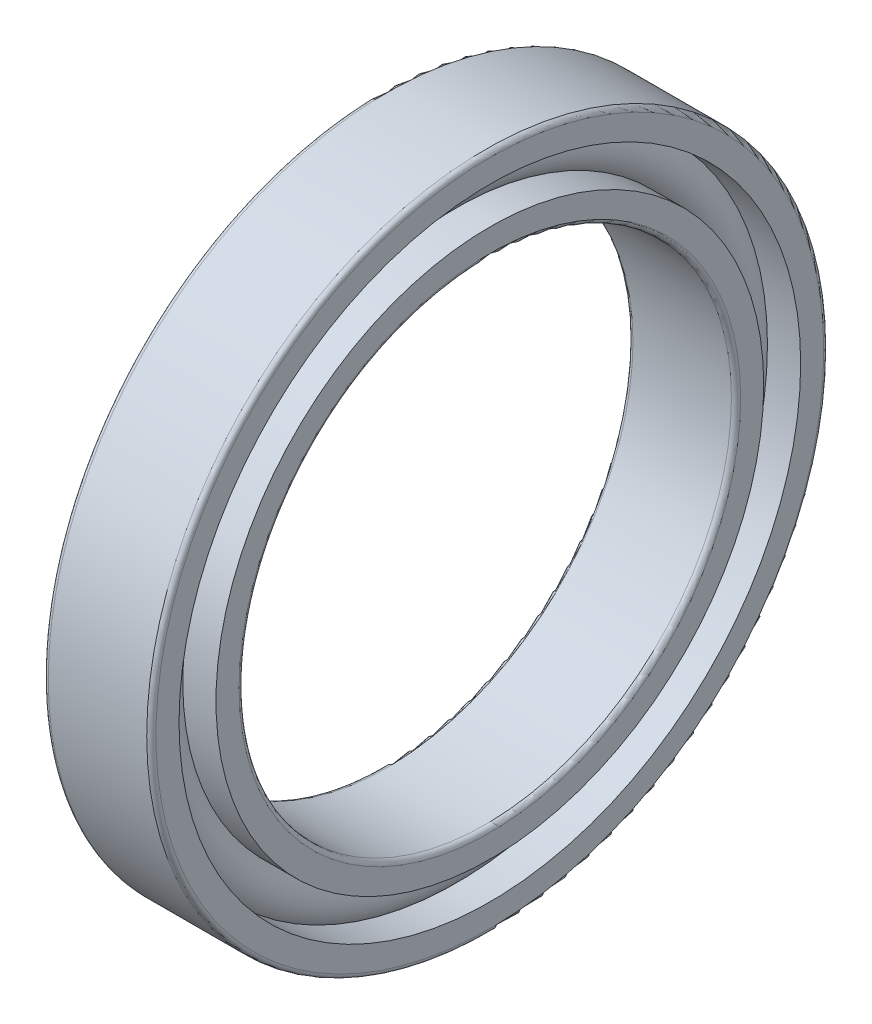
ISO-10303-21;
HEADER;
FILE_DESCRIPTION(('STEP AP214'),'2;1');
FILE_NAME('part.step','',(''),(''),'','','');
FILE_SCHEMA(('AUTOMOTIVE_DESIGN { 1 0 10303 214 1 1 1 1 }'));
ENDSEC;
DATA;
#1=APPLICATION_CONTEXT('core data for automotive mechanical design processes');
#2=APPLICATION_PROTOCOL_DEFINITION('international standard','automotive_design',2000,#1);
#3=PRODUCT_CONTEXT('',#1,'mechanical');
#4=PRODUCT('Part','Part','',(#3));
#5=PRODUCT_RELATED_PRODUCT_CATEGORY('part','',(#4));
#6=PRODUCT_DEFINITION_FORMATION('','',#4);
#7=PRODUCT_DEFINITION_CONTEXT('part definition',#1,'design');
#8=PRODUCT_DEFINITION('design','',#6,#7);
#9=PRODUCT_DEFINITION_SHAPE('','',#8);
#10=(LENGTH_UNIT() NAMED_UNIT(*) SI_UNIT(.MILLI.,.METRE.));
#11=(NAMED_UNIT(*) PLANE_ANGLE_UNIT() SI_UNIT($,.RADIAN.));
#12=(NAMED_UNIT(*) SI_UNIT($,.STERADIAN.) SOLID_ANGLE_UNIT());
#13=UNCERTAINTY_MEASURE_WITH_UNIT(LENGTH_MEASURE(1.E-05),#10,'distance_accuracy_value','');
#14=(GEOMETRIC_REPRESENTATION_CONTEXT(3) GLOBAL_UNCERTAINTY_ASSIGNED_CONTEXT((#13)) GLOBAL_UNIT_ASSIGNED_CONTEXT((#10,
#11,#12)) REPRESENTATION_CONTEXT('',''));
#15=CARTESIAN_POINT('',(0.,0.,0.));
#16=DIRECTION('',(0.,0.,1.));
#17=DIRECTION('',(1.,0.,0.));
#18=AXIS2_PLACEMENT_3D('',#15,#16,#17);
#19=CARTESIAN_POINT('',(0.,0.,0.));
#20=DIRECTION('',(-1.,0.,0.));
#21=DIRECTION('',(0.,0.,1.));
#22=AXIS2_PLACEMENT_3D('',#19,#20,#21);
#23=TOROIDAL_SURFACE('',#22,19.,1.8);
#24=CARTESIAN_POINT('',(1.34164078649987,0.,0.));
#25=DIRECTION('',(-1.,0.,0.));
#26=DIRECTION('',(0.,0.,1.));
#27=AXIS2_PLACEMENT_3D('',#24,#25,#26);
#28=CIRCLE('',#27,20.2);
#29=CARTESIAN_POINT('',(1.34164078649987,0.,20.2));
#30=VERTEX_POINT('',#29);
#31=EDGE_CURVE('E38',#30,#30,#28,.F.);
#32=ORIENTED_EDGE('',*,*,#31,.T.);
#33=EDGE_LOOP('',(#32));
#34=FACE_BOUND('',#33,.T.);
#35=CARTESIAN_POINT('',(1.34164078649988,0.,0.));
#36=DIRECTION('',(-1.,0.,0.));
#37=DIRECTION('',(0.,0.,1.));
#38=AXIS2_PLACEMENT_3D('',#35,#36,#37);
#39=CIRCLE('',#38,17.8);
#40=CARTESIAN_POINT('',(1.34164078649988,0.,17.8));
#41=VERTEX_POINT('',#40);
#42=EDGE_CURVE('E10',#41,#41,#39,.T.);
#43=ORIENTED_EDGE('',*,*,#42,.T.);
#44=EDGE_LOOP('',(#43));
#45=FACE_BOUND('',#44,.T.);
#46=ADVANCED_FACE('F34',(#34,#45),#23,.T.);
#47=CARTESIAN_POINT('',(-20.6375,0.,0.));
#48=DIRECTION('',(1.,0.,0.));
#49=DIRECTION('',(0.,0.,-1.));
#50=AXIS2_PLACEMENT_3D('',#47,#48,#49);
#51=CYLINDRICAL_SURFACE('',#50,17.8);
#52=CARTESIAN_POINT('',(3.5,0.,0.));
#53=DIRECTION('',(1.,0.,0.));
#54=DIRECTION('',(0.,0.,-1.));
#55=AXIS2_PLACEMENT_3D('',#52,#53,#54);
#56=CIRCLE('',#55,17.8);
#57=CARTESIAN_POINT('',(3.5,0.,-17.8));
#58=VERTEX_POINT('',#57);
#59=EDGE_CURVE('E47',#58,#58,#56,.T.);
#60=ORIENTED_EDGE('',*,*,#59,.F.);
#61=EDGE_LOOP('',(#60));
#62=FACE_BOUND('',#61,.T.);
#63=ORIENTED_EDGE('',*,*,#42,.F.);
#64=EDGE_LOOP('',(#63));
#65=FACE_BOUND('',#64,.T.);
#66=ADVANCED_FACE('F86',(#62,#65),#51,.T.);
#67=CARTESIAN_POINT('',(-20.6375,0.,0.));
#68=DIRECTION('',(1.,0.,0.));
#69=DIRECTION('',(0.,0.,-1.));
#70=AXIS2_PLACEMENT_3D('',#67,#68,#69);
#71=CYLINDRICAL_SURFACE('',#70,17.8);
#72=CARTESIAN_POINT('',(-3.5,0.,0.));
#73=DIRECTION('',(1.,0.,0.));
#74=DIRECTION('',(0.,0.,-1.));
#75=AXIS2_PLACEMENT_3D('',#72,#73,#74);
#76=CIRCLE('',#75,17.8);
#77=CARTESIAN_POINT('',(-3.5,0.,-17.8));
#78=VERTEX_POINT('',#77);
#79=EDGE_CURVE('E56',#78,#78,#76,.T.);
#80=ORIENTED_EDGE('',*,*,#79,.T.);
#81=EDGE_LOOP('',(#80));
#82=FACE_BOUND('',#81,.T.);
#83=CARTESIAN_POINT('',(-1.34164078649988,0.,0.));
#84=DIRECTION('',(1.,0.,0.));
#85=DIRECTION('',(0.,0.,-1.));
#86=AXIS2_PLACEMENT_3D('',#83,#84,#85);
#87=CIRCLE('',#86,17.8);
#88=CARTESIAN_POINT('',(-1.34164078649988,0.,-17.8));
#89=VERTEX_POINT('',#88);
#90=EDGE_CURVE('E42',#89,#89,#87,.T.);
#91=ORIENTED_EDGE('',*,*,#90,.F.);
#92=EDGE_LOOP('',(#91));
#93=FACE_BOUND('',#92,.T.);
#94=ADVANCED_FACE('F89',(#82,#93),#71,.T.);
#95=CARTESIAN_POINT('',(3.5,16.3,0.));
#96=DIRECTION('',(1.,0.,0.));
#97=DIRECTION('',(0.,0.,-1.));
#98=AXIS2_PLACEMENT_3D('',#95,#96,#97);
#99=PLANE('',#98);
#100=ORIENTED_EDGE('',*,*,#59,.T.);
#101=EDGE_LOOP('',(#100));
#102=FACE_BOUND('',#101,.T.);
#103=CARTESIAN_POINT('',(3.5,0.,0.));
#104=DIRECTION('',(1.,0.,0.));
#105=DIRECTION('',(0.,0.,-1.));
#106=AXIS2_PLACEMENT_3D('',#103,#104,#105);
#107=CIRCLE('',#106,16.3);
#108=CARTESIAN_POINT('',(3.5,0.,-16.3));
#109=VERTEX_POINT('',#108);
#110=EDGE_CURVE('E78',#109,#109,#107,.T.);
#111=ORIENTED_EDGE('',*,*,#110,.F.);
#112=EDGE_LOOP('',(#111));
#113=FACE_BOUND('',#112,.T.);
#114=ADVANCED_FACE('F83',(#102,#113),#99,.T.);
#115=CARTESIAN_POINT('',(3.2,0.,0.));
#116=DIRECTION('',(1.,0.,0.));
#117=DIRECTION('',(0.,0.,-1.));
#118=AXIS2_PLACEMENT_3D('',#115,#116,#117);
#119=TOROIDAL_SURFACE('',#118,16.3,0.300000000000001);
#120=ORIENTED_EDGE('',*,*,#110,.T.);
#121=EDGE_LOOP('',(#120));
#122=FACE_BOUND('',#121,.T.);
#123=CARTESIAN_POINT('',(3.2,0.,0.));
#124=DIRECTION('',(1.,0.,0.));
#125=DIRECTION('',(0.,0.,-1.));
#126=AXIS2_PLACEMENT_3D('',#123,#124,#125);
#127=CIRCLE('',#126,16.);
#128=CARTESIAN_POINT('',(3.2,0.,-16.));
#129=VERTEX_POINT('',#128);
#130=EDGE_CURVE('E75',#129,#129,#127,.T.);
#131=ORIENTED_EDGE('',*,*,#130,.F.);
#132=EDGE_LOOP('',(#131));
#133=FACE_BOUND('',#132,.T.);
#134=ADVANCED_FACE('F100',(#122,#133),#119,.T.);
#135=CARTESIAN_POINT('',(-20.6375,0.,0.));
#136=DIRECTION('',(1.,0.,0.));
#137=DIRECTION('',(0.,0.,-1.));
#138=AXIS2_PLACEMENT_3D('',#135,#136,#137);
#139=CYLINDRICAL_SURFACE('',#138,16.);
#140=ORIENTED_EDGE('',*,*,#130,.T.);
#141=EDGE_LOOP('',(#140));
#142=FACE_BOUND('',#141,.T.);
#143=CARTESIAN_POINT('',(-3.2,0.,0.));
#144=DIRECTION('',(1.,0.,0.));
#145=DIRECTION('',(0.,0.,-1.));
#146=AXIS2_PLACEMENT_3D('',#143,#144,#145);
#147=CIRCLE('',#146,16.);
#148=CARTESIAN_POINT('',(-3.2,0.,-16.));
#149=VERTEX_POINT('',#148);
#150=EDGE_CURVE('E72',#149,#149,#147,.T.);
#151=ORIENTED_EDGE('',*,*,#150,.F.);
#152=EDGE_LOOP('',(#151));
#153=FACE_BOUND('',#152,.T.);
#154=ADVANCED_FACE('F103',(#142,#153),#139,.F.);
#155=CARTESIAN_POINT('',(-3.2,0.,0.));
#156=DIRECTION('',(1.,0.,0.));
#157=DIRECTION('',(0.,0.,-1.));
#158=AXIS2_PLACEMENT_3D('',#155,#156,#157);
#159=TOROIDAL_SURFACE('',#158,16.3,0.300000000000001);
#160=ORIENTED_EDGE('',*,*,#150,.T.);
#161=EDGE_LOOP('',(#160));
#162=FACE_BOUND('',#161,.T.);
#163=CARTESIAN_POINT('',(-3.5,0.,0.));
#164=DIRECTION('',(1.,0.,0.));
#165=DIRECTION('',(0.,0.,-1.));
#166=AXIS2_PLACEMENT_3D('',#163,#164,#165);
#167=CIRCLE('',#166,16.3);
#168=CARTESIAN_POINT('',(-3.5,0.,-16.3));
#169=VERTEX_POINT('',#168);
#170=EDGE_CURVE('E69',#169,#169,#167,.T.);
#171=ORIENTED_EDGE('',*,*,#170,.F.);
#172=EDGE_LOOP('',(#171));
#173=FACE_BOUND('',#172,.T.);
#174=ADVANCED_FACE('F107',(#162,#173),#159,.T.);
#175=CARTESIAN_POINT('',(-3.5,17.8,0.));
#176=DIRECTION('',(-1.,0.,0.));
#177=DIRECTION('',(0.,0.,1.));
#178=AXIS2_PLACEMENT_3D('',#175,#176,#177);
#179=PLANE('',#178);
#180=ORIENTED_EDGE('',*,*,#170,.T.);
#181=EDGE_LOOP('',(#180));
#182=FACE_BOUND('',#181,.T.);
#183=ORIENTED_EDGE('',*,*,#79,.F.);
#184=EDGE_LOOP('',(#183));
#185=FACE_BOUND('',#184,.T.);
#186=ADVANCED_FACE('F111',(#182,#185),#179,.T.);
#187=CARTESIAN_POINT('',(-1.34164078649987,0.,0.));
#188=DIRECTION('',(1.,0.,0.));
#189=DIRECTION('',(0.,0.,-1.));
#190=AXIS2_PLACEMENT_3D('',#187,#188,#189);
#191=CIRCLE('',#190,20.2);
#192=CARTESIAN_POINT('',(-1.34164078649987,0.,-20.2));
#193=VERTEX_POINT('',#192);
#194=EDGE_CURVE('E50',#193,#193,#191,.F.);
#195=ORIENTED_EDGE('',*,*,#194,.T.);
#196=EDGE_LOOP('',(#195));
#197=FACE_BOUND('',#196,.T.);
#198=ORIENTED_EDGE('',*,*,#90,.T.);
#199=EDGE_LOOP('',(#198));
#200=FACE_BOUND('',#199,.T.);
#201=ADVANCED_FACE('F36',(#197,#200),#23,.T.);
#202=CARTESIAN_POINT('',(-20.6375,0.,0.));
#203=DIRECTION('',(1.,0.,0.));
#204=DIRECTION('',(0.,0.,-1.));
#205=AXIS2_PLACEMENT_3D('',#202,#203,#204);
#206=CYLINDRICAL_SURFACE('',#205,20.2);
#207=CARTESIAN_POINT('',(3.5,0.,0.));
#208=DIRECTION('',(1.,0.,0.));
#209=DIRECTION('',(0.,0.,-1.));
#210=AXIS2_PLACEMENT_3D('',#207,#208,#209);
#211=CIRCLE('',#210,20.2);
#212=CARTESIAN_POINT('',(3.5,0.,-20.2));
#213=VERTEX_POINT('',#212);
#214=EDGE_CURVE('E52',#213,#213,#211,.T.);
#215=ORIENTED_EDGE('',*,*,#214,.T.);
#216=EDGE_LOOP('',(#215));
#217=FACE_BOUND('',#216,.T.);
#218=ORIENTED_EDGE('',*,*,#31,.F.);
#219=EDGE_LOOP('',(#218));
#220=FACE_BOUND('',#219,.T.);
#221=ADVANCED_FACE('F116',(#217,#220),#206,.F.);
#222=CARTESIAN_POINT('',(-20.6375,0.,0.));
#223=DIRECTION('',(1.,0.,0.));
#224=DIRECTION('',(0.,0.,-1.));
#225=AXIS2_PLACEMENT_3D('',#222,#223,#224);
#226=CYLINDRICAL_SURFACE('',#225,20.2);
#227=CARTESIAN_POINT('',(-3.5,0.,0.));
#228=DIRECTION('',(1.,0.,0.));
#229=DIRECTION('',(0.,0.,-1.));
#230=AXIS2_PLACEMENT_3D('',#227,#228,#229);
#231=CIRCLE('',#230,20.2);
#232=CARTESIAN_POINT('',(-3.5,0.,-20.2));
#233=VERTEX_POINT('',#232);
#234=EDGE_CURVE('E147',#233,#233,#231,.T.);
#235=ORIENTED_EDGE('',*,*,#234,.F.);
#236=EDGE_LOOP('',(#235));
#237=FACE_BOUND('',#236,.T.);
#238=ORIENTED_EDGE('',*,*,#194,.F.);
#239=EDGE_LOOP('',(#238));
#240=FACE_BOUND('',#239,.T.);
#241=ADVANCED_FACE('F119',(#237,#240),#226,.F.);
#242=CARTESIAN_POINT('',(3.5,21.7,0.));
#243=DIRECTION('',(1.,0.,0.));
#244=DIRECTION('',(0.,0.,-1.));
#245=AXIS2_PLACEMENT_3D('',#242,#243,#244);
#246=PLANE('',#245);
#247=CARTESIAN_POINT('',(3.5,0.,0.));
#248=DIRECTION('',(1.,0.,0.));
#249=DIRECTION('',(0.,0.,-1.));
#250=AXIS2_PLACEMENT_3D('',#247,#248,#249);
#251=CIRCLE('',#250,21.7);
#252=CARTESIAN_POINT('',(3.5,0.,-21.7));
#253=VERTEX_POINT('',#252);
#254=EDGE_CURVE('E58',#253,#253,#251,.T.);
#255=ORIENTED_EDGE('',*,*,#254,.T.);
#256=EDGE_LOOP('',(#255));
#257=FACE_BOUND('',#256,.T.);
#258=ORIENTED_EDGE('',*,*,#214,.F.);
#259=EDGE_LOOP('',(#258));
#260=FACE_BOUND('',#259,.T.);
#261=ADVANCED_FACE('F120',(#257,#260),#246,.T.);
#262=CARTESIAN_POINT('',(3.2,0.,0.));
#263=DIRECTION('',(1.,0.,0.));
#264=DIRECTION('',(0.,0.,-1.));
#265=AXIS2_PLACEMENT_3D('',#262,#263,#264);
#266=TOROIDAL_SURFACE('',#265,21.7,0.300000000000003);
#267=CARTESIAN_POINT('',(3.2,0.,0.));
#268=DIRECTION('',(1.,0.,0.));
#269=DIRECTION('',(0.,0.,-1.));
#270=AXIS2_PLACEMENT_3D('',#267,#268,#269);
#271=CIRCLE('',#270,22.);
#272=CARTESIAN_POINT('',(3.2,0.,-22.));
#273=VERTEX_POINT('',#272);
#274=EDGE_CURVE('E63',#273,#273,#271,.T.);
#275=ORIENTED_EDGE('',*,*,#274,.T.);
#276=EDGE_LOOP('',(#275));
#277=FACE_BOUND('',#276,.T.);
#278=ORIENTED_EDGE('',*,*,#254,.F.);
#279=EDGE_LOOP('',(#278));
#280=FACE_BOUND('',#279,.T.);
#281=ADVANCED_FACE('F123',(#277,#280),#266,.T.);
#282=CARTESIAN_POINT('',(-20.6375,0.,0.));
#283=DIRECTION('',(1.,0.,0.));
#284=DIRECTION('',(0.,0.,-1.));
#285=AXIS2_PLACEMENT_3D('',#282,#283,#284);
#286=CYLINDRICAL_SURFACE('',#285,22.);
#287=CARTESIAN_POINT('',(-3.2,0.,0.));
#288=DIRECTION('',(1.,0.,0.));
#289=DIRECTION('',(0.,0.,-1.));
#290=AXIS2_PLACEMENT_3D('',#287,#288,#289);
#291=CIRCLE('',#290,22.);
#292=CARTESIAN_POINT('',(-3.2,0.,-22.));
#293=VERTEX_POINT('',#292);
#294=EDGE_CURVE('E151',#293,#293,#291,.T.);
#295=ORIENTED_EDGE('',*,*,#294,.T.);
#296=EDGE_LOOP('',(#295));
#297=FACE_BOUND('',#296,.T.);
#298=ORIENTED_EDGE('',*,*,#274,.F.);
#299=EDGE_LOOP('',(#298));
#300=FACE_BOUND('',#299,.T.);
#301=ADVANCED_FACE('F127',(#297,#300),#286,.T.);
#302=CARTESIAN_POINT('',(-3.2,0.,0.));
#303=DIRECTION('',(1.,0.,0.));
#304=DIRECTION('',(0.,0.,-1.));
#305=AXIS2_PLACEMENT_3D('',#302,#303,#304);
#306=TOROIDAL_SURFACE('',#305,21.7,0.300000000000003);
#307=CARTESIAN_POINT('',(-3.5,0.,0.));
#308=DIRECTION('',(1.,0.,0.));
#309=DIRECTION('',(0.,0.,-1.));
#310=AXIS2_PLACEMENT_3D('',#307,#308,#309);
#311=CIRCLE('',#310,21.7);
#312=CARTESIAN_POINT('',(-3.5,0.,-21.7));
#313=VERTEX_POINT('',#312);
#314=EDGE_CURVE('E148',#313,#313,#311,.T.);
#315=ORIENTED_EDGE('',*,*,#314,.T.);
#316=EDGE_LOOP('',(#315));
#317=FACE_BOUND('',#316,.T.);
#318=ORIENTED_EDGE('',*,*,#294,.F.);
#319=EDGE_LOOP('',(#318));
#320=FACE_BOUND('',#319,.T.);
#321=ADVANCED_FACE('F131',(#317,#320),#306,.T.);
#322=CARTESIAN_POINT('',(-3.5,20.2,0.));
#323=DIRECTION('',(-1.,0.,0.));
#324=DIRECTION('',(0.,0.,1.));
#325=AXIS2_PLACEMENT_3D('',#322,#323,#324);
#326=PLANE('',#325);
#327=ORIENTED_EDGE('',*,*,#234,.T.);
#328=EDGE_LOOP('',(#327));
#329=FACE_BOUND('',#328,.T.);
#330=ORIENTED_EDGE('',*,*,#314,.F.);
#331=EDGE_LOOP('',(#330));
#332=FACE_BOUND('',#331,.T.);
#333=ADVANCED_FACE('F135',(#329,#332),#326,.T.);
#334=CLOSED_SHELL('',(#46,#66,#94,#114,#134,#154,#174,#186,#201,#221,#241,#261,#281,#301,#321,#333));
#335=MANIFOLD_SOLID_BREP('B2',#334);
#336=ADVANCED_BREP_SHAPE_REPRESENTATION('',(#18,#335),#14);
#337=SHAPE_DEFINITION_REPRESENTATION(#9,#336);
ENDSEC;
END-ISO-10303-21;
